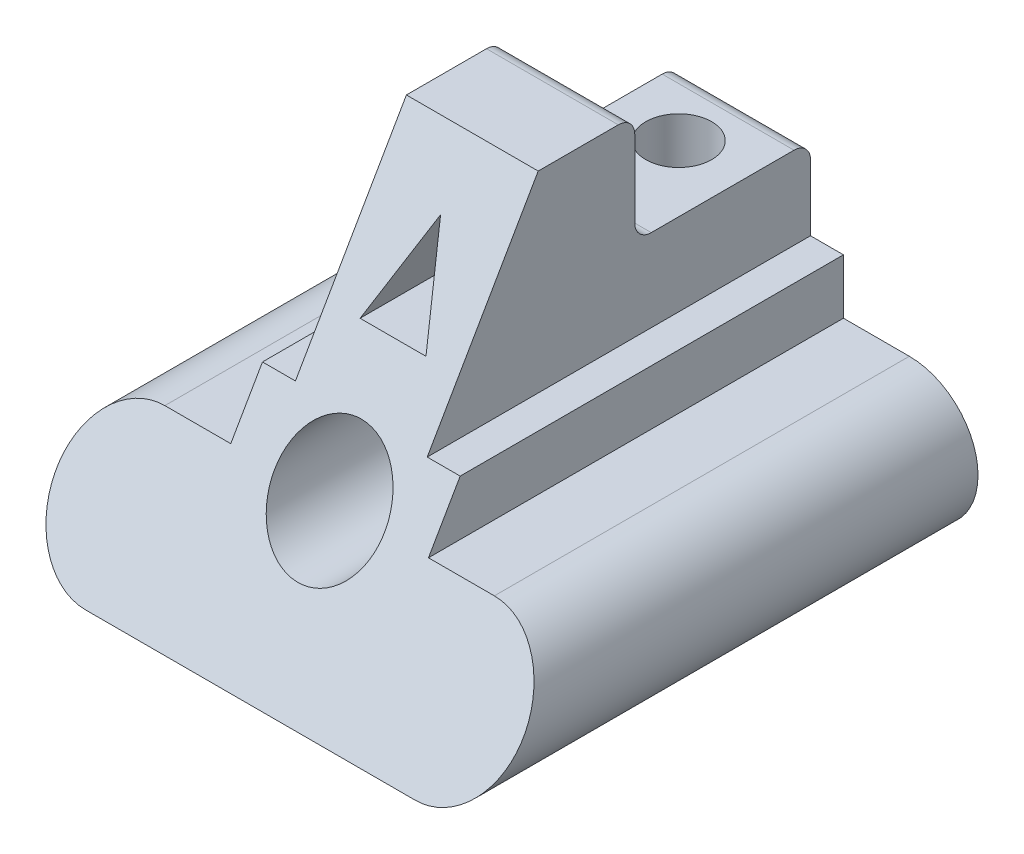
ISO-10303-21;
HEADER;
FILE_DESCRIPTION(('STEP AP214'),'2;1');
FILE_NAME('part.step','',(''),(''),'','','');
FILE_SCHEMA(('AUTOMOTIVE_DESIGN { 1 0 10303 214 1 1 1 1 }'));
ENDSEC;
DATA;
#1=APPLICATION_CONTEXT('core data for automotive mechanical design processes');
#2=APPLICATION_PROTOCOL_DEFINITION('international standard','automotive_design',2000,#1);
#3=PRODUCT_CONTEXT('',#1,'mechanical');
#4=PRODUCT('Part','Part','',(#3));
#5=PRODUCT_RELATED_PRODUCT_CATEGORY('part','',(#4));
#6=PRODUCT_DEFINITION_FORMATION('','',#4);
#7=PRODUCT_DEFINITION_CONTEXT('part definition',#1,'design');
#8=PRODUCT_DEFINITION('design','',#6,#7);
#9=PRODUCT_DEFINITION_SHAPE('','',#8);
#10=(LENGTH_UNIT() NAMED_UNIT(*) SI_UNIT(.MILLI.,.METRE.));
#11=(NAMED_UNIT(*) PLANE_ANGLE_UNIT() SI_UNIT($,.RADIAN.));
#12=(NAMED_UNIT(*) SI_UNIT($,.STERADIAN.) SOLID_ANGLE_UNIT());
#13=UNCERTAINTY_MEASURE_WITH_UNIT(LENGTH_MEASURE(1.E-05),#10,'distance_accuracy_value','');
#14=(GEOMETRIC_REPRESENTATION_CONTEXT(3) GLOBAL_UNCERTAINTY_ASSIGNED_CONTEXT((#13)) GLOBAL_UNIT_ASSIGNED_CONTEXT((#10,
#11,#12)) REPRESENTATION_CONTEXT('',''));
#15=CARTESIAN_POINT('',(0.,0.,0.));
#16=DIRECTION('',(0.,0.,1.));
#17=DIRECTION('',(1.,0.,0.));
#18=AXIS2_PLACEMENT_3D('',#15,#16,#17);
#19=CARTESIAN_POINT('',(-42.5,57.5,4.58548115672677));
#20=DIRECTION('',(0.,-0.499999999999995,-0.866025403784442));
#21=DIRECTION('',(0.,0.866025403784442,-0.499999999999995));
#22=AXIS2_PLACEMENT_3D('',#19,#20,#21);
#23=PLANE('',#22);
#24=CARTESIAN_POINT('',(30.,0.,37.7831216351298));
#25=DIRECTION('',(0.,-0.499999999999995,-0.866025403784442));
#26=DIRECTION('',(0.,0.866025403784442,-0.499999999999995));
#27=AXIS2_PLACEMENT_3D('',#24,#25,#26);
#28=ELLIPSE('',#27,14.4337567297406,12.5);
#29=CARTESIAN_POINT('',(30.,12.5,30.5662432702596));
#30=VERTEX_POINT('',#29);
#31=CARTESIAN_POINT('',(30.,-12.5,45.));
#32=VERTEX_POINT('',#31);
#33=EDGE_CURVE('E255',#30,#32,#28,.T.);
#34=ORIENTED_EDGE('',*,*,#33,.F.);
#35=DIRECTION('',(1.,0.,0.));
#36=VECTOR('',#35,1.);
#37=CARTESIAN_POINT('',(30.,12.5,30.5662432702596));
#38=LINE('',#37,#36);
#39=CARTESIAN_POINT('',(18.,12.5,30.5662432702596));
#40=VERTEX_POINT('',#39);
#41=EDGE_CURVE('E251',#40,#30,#38,.T.);
#42=ORIENTED_EDGE('',*,*,#41,.F.);
#43=DIRECTION('',(0.,-0.866025403784442,0.499999999999995));
#44=VECTOR('',#43,1.);
#45=CARTESIAN_POINT('',(18.,6.25000000000014,34.1746824526946));
#46=LINE('',#45,#44);
#47=CARTESIAN_POINT('',(18.,22.5,24.7927405783634));
#48=VERTEX_POINT('',#47);
#49=EDGE_CURVE('E247',#48,#40,#46,.T.);
#50=ORIENTED_EDGE('',*,*,#49,.F.);
#51=DIRECTION('',(1.,0.,0.));
#52=VECTOR('',#51,1.);
#53=CARTESIAN_POINT('',(18.,22.5,24.7927405783634));
#54=LINE('',#53,#52);
#55=CARTESIAN_POINT('',(12.,22.5,24.7927405783634));
#56=VERTEX_POINT('',#55);
#57=EDGE_CURVE('E243',#56,#48,#54,.T.);
#58=ORIENTED_EDGE('',*,*,#57,.F.);
#59=DIRECTION('',(0.,-0.866025403784442,0.499999999999995));
#60=VECTOR('',#59,1.);
#61=CARTESIAN_POINT('',(12.,13.7500000000002,29.8445554337724));
#62=LINE('',#61,#60);
#63=CARTESIAN_POINT('',(12.,57.5,4.58548115672677));
#64=VERTEX_POINT('',#63);
#65=EDGE_CURVE('E239',#64,#56,#62,.T.);
#66=ORIENTED_EDGE('',*,*,#65,.F.);
#67=DIRECTION('',(1.,0.,0.));
#68=VECTOR('',#67,1.);
#69=CARTESIAN_POINT('',(-42.5,57.5,4.58548115672677));
#70=LINE('',#69,#68);
#71=CARTESIAN_POINT('',(-12.,57.5,4.58548115672677));
#72=VERTEX_POINT('',#71);
#73=EDGE_CURVE('E216',#72,#64,#70,.T.);
#74=ORIENTED_EDGE('',*,*,#73,.F.);
#75=DIRECTION('',(0.,0.866025403784442,-0.499999999999995));
#76=VECTOR('',#75,1.);
#77=CARTESIAN_POINT('',(-12.,13.7500000000002,29.8445554337724));
#78=LINE('',#77,#76);
#79=CARTESIAN_POINT('',(-12.,22.5,24.7927405783634));
#80=VERTEX_POINT('',#79);
#81=EDGE_CURVE('E232',#80,#72,#78,.T.);
#82=ORIENTED_EDGE('',*,*,#81,.F.);
#83=DIRECTION('',(1.,0.,0.));
#84=VECTOR('',#83,1.);
#85=CARTESIAN_POINT('',(-18.,22.5,24.7927405783634));
#86=LINE('',#85,#84);
#87=CARTESIAN_POINT('',(-18.,22.5,24.7927405783634));
#88=VERTEX_POINT('',#87);
#89=EDGE_CURVE('E228',#88,#80,#86,.T.);
#90=ORIENTED_EDGE('',*,*,#89,.F.);
#91=DIRECTION('',(0.,0.866025403784442,-0.499999999999995));
#92=VECTOR('',#91,1.);
#93=CARTESIAN_POINT('',(-18.,6.25000000000014,34.1746824526946));
#94=LINE('',#93,#92);
#95=CARTESIAN_POINT('',(-18.,12.5,30.5662432702596));
#96=VERTEX_POINT('',#95);
#97=EDGE_CURVE('E224',#96,#88,#94,.T.);
#98=ORIENTED_EDGE('',*,*,#97,.F.);
#99=DIRECTION('',(1.,0.,0.));
#100=VECTOR('',#99,1.);
#101=CARTESIAN_POINT('',(-30.,12.5,30.5662432702596));
#102=LINE('',#101,#100);
#103=CARTESIAN_POINT('',(-30.,12.5,30.5662432702596));
#104=VERTEX_POINT('',#103);
#105=EDGE_CURVE('E220',#104,#96,#102,.T.);
#106=ORIENTED_EDGE('',*,*,#105,.F.);
#107=CARTESIAN_POINT('',(-30.,0.,37.7831216351298));
#108=DIRECTION('',(0.,-0.499999999999995,-0.866025403784442));
#109=DIRECTION('',(0.,0.866025403784442,-0.499999999999995));
#110=AXIS2_PLACEMENT_3D('',#107,#108,#109);
#111=ELLIPSE('',#110,14.4337567297406,12.5);
#112=CARTESIAN_POINT('',(-30.,-12.5,45.));
#113=VERTEX_POINT('',#112);
#114=EDGE_CURVE('E236',#113,#104,#111,.T.);
#115=ORIENTED_EDGE('',*,*,#114,.F.);
#116=DIRECTION('',(1.,0.,0.));
#117=VECTOR('',#116,1.);
#118=CARTESIAN_POINT('',(-30.,-12.5,45.));
#119=LINE('',#118,#117);
#120=EDGE_CURVE('E259',#113,#32,#119,.T.);
#121=ORIENTED_EDGE('',*,*,#120,.T.);
#122=EDGE_LOOP('',(#34,#42,#50,#58,#66,#74,#82,#90,#98,#106,#115,#121));
#123=FACE_BOUND('',#122,.T.);
#124=DIRECTION('',(-0.32732683535399,0.818317088384974,-0.472455591261529));
#125=VECTOR('',#124,1.);
#126=CARTESIAN_POINT('',(-8.12500000000003,67.8125000000001,-1.3684434942912));
#127=LINE('',#126,#125);
#128=CARTESIAN_POINT('',(6.,32.5,19.0192378864672));
#129=VERTEX_POINT('',#128);
#130=CARTESIAN_POINT('',(0.,47.5,10.3589838486229));
#131=VERTEX_POINT('',#130);
#132=EDGE_CURVE('E351',#129,#131,#127,.T.);
#133=ORIENTED_EDGE('',*,*,#132,.F.);
#134=DIRECTION('',(1.,0.,0.));
#135=VECTOR('',#134,1.);
#136=CARTESIAN_POINT('',(-42.5,32.5,19.0192378864672));
#137=LINE('',#136,#135);
#138=CARTESIAN_POINT('',(-6.,32.5,19.0192378864672));
#139=VERTEX_POINT('',#138);
#140=EDGE_CURVE('E186',#139,#129,#137,.T.);
#141=ORIENTED_EDGE('',*,*,#140,.F.);
#142=DIRECTION('',(-0.32732683535399,-0.818317088384974,0.472455591261529));
#143=VECTOR('',#142,1.);
#144=CARTESIAN_POINT('',(-0.982142857142883,45.0446428571428,11.7765849560082));
#145=LINE('',#144,#143);
#146=EDGE_CURVE('E347',#131,#139,#145,.T.);
#147=ORIENTED_EDGE('',*,*,#146,.F.);
#148=EDGE_LOOP('',(#133,#141,#147));
#149=FACE_BOUND('',#148,.T.);
#150=CARTESIAN_POINT('',(0.,12.5,30.5662432702596));
#151=DIRECTION('',(0.,-0.499999999999995,-0.866025403784442));
#152=DIRECTION('',(0.,0.866025403784442,-0.499999999999995));
#153=AXIS2_PLACEMENT_3D('',#150,#151,#152);
#154=ELLIPSE('',#153,11.5470053837925,10.);
#155=CARTESIAN_POINT('',(0.,22.5,24.7927405783634));
#156=VERTEX_POINT('',#155);
#157=EDGE_CURVE('E212',#156,#156,#154,.F.);
#158=ORIENTED_EDGE('',*,*,#157,.F.);
#159=EDGE_LOOP('',(#158));
#160=FACE_BOUND('',#159,.T.);
#161=ADVANCED_FACE('F41',(#123,#149,#160),#23,.F.);
#162=CARTESIAN_POINT('',(-30.,0.,45.));
#163=DIRECTION('',(0.,0.,-1.));
#164=DIRECTION('',(-1.,0.,0.));
#165=AXIS2_PLACEMENT_3D('',#162,#163,#164);
#166=CYLINDRICAL_SURFACE('',#165,12.5);
#167=DIRECTION('',(0.,0.,-1.));
#168=VECTOR('',#167,1.);
#169=CARTESIAN_POINT('',(-30.,-12.5,45.));
#170=LINE('',#169,#168);
#171=CARTESIAN_POINT('',(-30.,-12.5,-45.));
#172=VERTEX_POINT('',#171);
#173=EDGE_CURVE('E341',#113,#172,#170,.T.);
#174=ORIENTED_EDGE('',*,*,#173,.F.);
#175=ORIENTED_EDGE('',*,*,#114,.T.);
#176=DIRECTION('',(0.,0.,-1.));
#177=VECTOR('',#176,1.);
#178=CARTESIAN_POINT('',(-30.,12.5,45.));
#179=LINE('',#178,#177);
#180=CARTESIAN_POINT('',(-30.,12.5,-45.));
#181=VERTEX_POINT('',#180);
#182=EDGE_CURVE('E263',#104,#181,#179,.T.);
#183=ORIENTED_EDGE('',*,*,#182,.T.);
#184=CARTESIAN_POINT('',(-30.,0.,-45.));
#185=DIRECTION('',(0.,0.,1.));
#186=DIRECTION('',(1.,0.,0.));
#187=AXIS2_PLACEMENT_3D('',#184,#185,#186);
#188=CIRCLE('',#187,12.5);
#189=EDGE_CURVE('E258',#181,#172,#188,.T.);
#190=ORIENTED_EDGE('',*,*,#189,.T.);
#191=EDGE_LOOP('',(#174,#175,#183,#190));
#192=FACE_BOUND('',#191,.T.);
#193=ADVANCED_FACE('F436',(#192),#166,.T.);
#194=CARTESIAN_POINT('',(-30.,-12.5,45.));
#195=DIRECTION('',(0.,1.,0.));
#196=DIRECTION('',(0.,0.,1.));
#197=AXIS2_PLACEMENT_3D('',#194,#195,#196);
#198=PLANE('',#197);
#199=CARTESIAN_POINT('',(0.,-12.5,-33.));
#200=DIRECTION('',(0.,1.,0.));
#201=DIRECTION('',(0.,0.,1.));
#202=AXIS2_PLACEMENT_3D('',#199,#200,#201);
#203=CIRCLE('',#202,6.);
#204=CARTESIAN_POINT('',(0.,-12.5,-27.));
#205=VERTEX_POINT('',#204);
#206=EDGE_CURVE('E367',#205,#205,#203,.T.);
#207=ORIENTED_EDGE('',*,*,#206,.T.);
#208=EDGE_LOOP('',(#207));
#209=FACE_BOUND('',#208,.T.);
#210=DIRECTION('',(1.,0.,0.));
#211=VECTOR('',#210,1.);
#212=CARTESIAN_POINT('',(-30.,-12.5,-45.));
#213=LINE('',#212,#211);
#214=CARTESIAN_POINT('',(30.,-12.5,-45.));
#215=VERTEX_POINT('',#214);
#216=EDGE_CURVE('E268',#172,#215,#213,.T.);
#217=ORIENTED_EDGE('',*,*,#216,.T.);
#218=DIRECTION('',(0.,0.,-1.));
#219=VECTOR('',#218,1.);
#220=CARTESIAN_POINT('',(30.,-12.5,45.));
#221=LINE('',#220,#219);
#222=EDGE_CURVE('E337',#32,#215,#221,.T.);
#223=ORIENTED_EDGE('',*,*,#222,.F.);
#224=ORIENTED_EDGE('',*,*,#120,.F.);
#225=ORIENTED_EDGE('',*,*,#173,.T.);
#226=EDGE_LOOP('',(#217,#223,#224,#225));
#227=FACE_BOUND('',#226,.T.);
#228=ADVANCED_FACE('F501',(#209,#227),#198,.F.);
#229=CARTESIAN_POINT('',(30.,0.,45.));
#230=DIRECTION('',(0.,0.,-1.));
#231=DIRECTION('',(-1.,0.,0.));
#232=AXIS2_PLACEMENT_3D('',#229,#230,#231);
#233=CYLINDRICAL_SURFACE('',#232,12.5);
#234=ORIENTED_EDGE('',*,*,#33,.T.);
#235=ORIENTED_EDGE('',*,*,#222,.T.);
#236=CARTESIAN_POINT('',(30.,0.,-45.));
#237=DIRECTION('',(0.,0.,1.));
#238=DIRECTION('',(-1.,0.,0.));
#239=AXIS2_PLACEMENT_3D('',#236,#237,#238);
#240=CIRCLE('',#239,12.5);
#241=CARTESIAN_POINT('',(30.,12.5,-45.));
#242=VERTEX_POINT('',#241);
#243=EDGE_CURVE('E271',#215,#242,#240,.T.);
#244=ORIENTED_EDGE('',*,*,#243,.T.);
#245=DIRECTION('',(0.,0.,-1.));
#246=VECTOR('',#245,1.);
#247=CARTESIAN_POINT('',(30.,12.5,45.));
#248=LINE('',#247,#246);
#249=EDGE_CURVE('E334',#30,#242,#248,.T.);
#250=ORIENTED_EDGE('',*,*,#249,.F.);
#251=EDGE_LOOP('',(#234,#235,#244,#250));
#252=FACE_BOUND('',#251,.T.);
#253=ADVANCED_FACE('F497',(#252),#233,.T.);
#254=CARTESIAN_POINT('',(30.,12.5,45.));
#255=DIRECTION('',(0.,-1.,0.));
#256=DIRECTION('',(0.,0.,-1.));
#257=AXIS2_PLACEMENT_3D('',#254,#255,#256);
#258=PLANE('',#257);
#259=DIRECTION('',(0.,0.,-1.));
#260=VECTOR('',#259,1.);
#261=CARTESIAN_POINT('',(18.,12.5,45.));
#262=LINE('',#261,#260);
#263=CARTESIAN_POINT('',(18.,12.5,-45.));
#264=VERTEX_POINT('',#263);
#265=EDGE_CURVE('E331',#40,#264,#262,.T.);
#266=ORIENTED_EDGE('',*,*,#265,.F.);
#267=ORIENTED_EDGE('',*,*,#41,.T.);
#268=ORIENTED_EDGE('',*,*,#249,.T.);
#269=DIRECTION('',(-1.,0.,0.));
#270=VECTOR('',#269,1.);
#271=CARTESIAN_POINT('',(30.,12.5,-45.));
#272=LINE('',#271,#270);
#273=EDGE_CURVE('E275',#242,#264,#272,.T.);
#274=ORIENTED_EDGE('',*,*,#273,.T.);
#275=EDGE_LOOP('',(#266,#267,#268,#274));
#276=FACE_BOUND('',#275,.T.);
#277=ADVANCED_FACE('F493',(#276),#258,.F.);
#278=CARTESIAN_POINT('',(18.,12.5,45.));
#279=DIRECTION('',(-1.,0.,0.));
#280=DIRECTION('',(0.,0.,1.));
#281=AXIS2_PLACEMENT_3D('',#278,#279,#280);
#282=PLANE('',#281);
#283=DIRECTION('',(0.,0.,-1.));
#284=VECTOR('',#283,1.);
#285=CARTESIAN_POINT('',(18.,22.5,45.));
#286=LINE('',#285,#284);
#287=CARTESIAN_POINT('',(18.,22.5,-45.));
#288=VERTEX_POINT('',#287);
#289=EDGE_CURVE('E328',#48,#288,#286,.T.);
#290=ORIENTED_EDGE('',*,*,#289,.F.);
#291=ORIENTED_EDGE('',*,*,#49,.T.);
#292=ORIENTED_EDGE('',*,*,#265,.T.);
#293=DIRECTION('',(0.,1.,0.));
#294=VECTOR('',#293,1.);
#295=CARTESIAN_POINT('',(18.,12.5,-45.));
#296=LINE('',#295,#294);
#297=EDGE_CURVE('E279',#264,#288,#296,.T.);
#298=ORIENTED_EDGE('',*,*,#297,.T.);
#299=EDGE_LOOP('',(#290,#291,#292,#298));
#300=FACE_BOUND('',#299,.T.);
#301=ADVANCED_FACE('F489',(#300),#282,.F.);
#302=CARTESIAN_POINT('',(18.,22.5,45.));
#303=DIRECTION('',(0.,-1.,0.));
#304=DIRECTION('',(0.,0.,-1.));
#305=AXIS2_PLACEMENT_3D('',#302,#303,#304);
#306=PLANE('',#305);
#307=DIRECTION('',(0.,0.,-1.));
#308=VECTOR('',#307,1.);
#309=CARTESIAN_POINT('',(12.,22.5,45.));
#310=LINE('',#309,#308);
#311=CARTESIAN_POINT('',(12.,22.5,-45.));
#312=VERTEX_POINT('',#311);
#313=EDGE_CURVE('E325',#56,#312,#310,.T.);
#314=ORIENTED_EDGE('',*,*,#313,.F.);
#315=ORIENTED_EDGE('',*,*,#57,.T.);
#316=ORIENTED_EDGE('',*,*,#289,.T.);
#317=DIRECTION('',(-1.,0.,0.));
#318=VECTOR('',#317,1.);
#319=CARTESIAN_POINT('',(18.,22.5,-45.));
#320=LINE('',#319,#318);
#321=EDGE_CURVE('E283',#288,#312,#320,.T.);
#322=ORIENTED_EDGE('',*,*,#321,.T.);
#323=EDGE_LOOP('',(#314,#315,#316,#322));
#324=FACE_BOUND('',#323,.T.);
#325=ADVANCED_FACE('F486',(#324),#306,.F.);
#326=CARTESIAN_POINT('',(12.,22.5,45.));
#327=DIRECTION('',(-1.,0.,0.));
#328=DIRECTION('',(0.,0.,1.));
#329=AXIS2_PLACEMENT_3D('',#326,#327,#328);
#330=PLANE('',#329);
#331=DIRECTION('',(0.,1.,0.));
#332=VECTOR('',#331,1.);
#333=CARTESIAN_POINT('',(12.,22.5,-13.));
#334=LINE('',#333,#332);
#335=CARTESIAN_POINT('',(12.,40.5,-13.));
#336=VERTEX_POINT('',#335);
#337=CARTESIAN_POINT('',(12.,54.5,-13.));
#338=VERTEX_POINT('',#337);
#339=EDGE_CURVE('E415',#336,#338,#334,.T.);
#340=ORIENTED_EDGE('',*,*,#339,.T.);
#341=CARTESIAN_POINT('',(12.,54.5,-9.99999999999999));
#342=DIRECTION('',(-1.,0.,0.));
#343=DIRECTION('',(0.,0.,1.));
#344=AXIS2_PLACEMENT_3D('',#341,#342,#343);
#345=CIRCLE('',#344,3.);
#346=CARTESIAN_POINT('',(12.,57.5,-9.99999999999998));
#347=VERTEX_POINT('',#346);
#348=EDGE_CURVE('E386',#338,#347,#345,.F.);
#349=ORIENTED_EDGE('',*,*,#348,.T.);
#350=DIRECTION('',(0.,0.,-1.));
#351=VECTOR('',#350,1.);
#352=CARTESIAN_POINT('',(12.,57.5,45.));
#353=LINE('',#352,#351);
#354=EDGE_CURVE('E321',#64,#347,#353,.T.);
#355=ORIENTED_EDGE('',*,*,#354,.F.);
#356=ORIENTED_EDGE('',*,*,#65,.T.);
#357=ORIENTED_EDGE('',*,*,#313,.T.);
#358=DIRECTION('',(0.,1.,0.));
#359=VECTOR('',#358,1.);
#360=CARTESIAN_POINT('',(12.,22.5,-45.));
#361=LINE('',#360,#359);
#362=CARTESIAN_POINT('',(12.,34.5,-45.));
#363=VERTEX_POINT('',#362);
#364=EDGE_CURVE('E287',#312,#363,#361,.T.);
#365=ORIENTED_EDGE('',*,*,#364,.T.);
#366=CARTESIAN_POINT('',(12.,34.5,-42.));
#367=DIRECTION('',(-1.,0.,0.));
#368=DIRECTION('',(0.,0.,1.));
#369=AXIS2_PLACEMENT_3D('',#366,#367,#368);
#370=CIRCLE('',#369,3.);
#371=CARTESIAN_POINT('',(12.,37.5,-42.));
#372=VERTEX_POINT('',#371);
#373=EDGE_CURVE('E57',#363,#372,#370,.F.);
#374=ORIENTED_EDGE('',*,*,#373,.T.);
#375=DIRECTION('',(0.,0.,1.));
#376=VECTOR('',#375,1.);
#377=CARTESIAN_POINT('',(12.,37.5,45.));
#378=LINE('',#377,#376);
#379=CARTESIAN_POINT('',(12.,37.5,-16.));
#380=VERTEX_POINT('',#379);
#381=EDGE_CURVE('E407',#372,#380,#378,.T.);
#382=ORIENTED_EDGE('',*,*,#381,.T.);
#383=CARTESIAN_POINT('',(12.,40.5,-16.));
#384=DIRECTION('',(-1.,0.,0.));
#385=DIRECTION('',(0.,0.,1.));
#386=AXIS2_PLACEMENT_3D('',#383,#384,#385);
#387=CIRCLE('',#386,3.);
#388=EDGE_CURVE('E11',#380,#336,#387,.T.);
#389=ORIENTED_EDGE('',*,*,#388,.T.);
#390=EDGE_LOOP('',(#340,#349,#355,#356,#357,#365,#374,#382,#389));
#391=FACE_BOUND('',#390,.T.);
#392=ADVANCED_FACE('F414',(#391),#330,.F.);
#393=CARTESIAN_POINT('',(-12.,57.5,45.));
#394=DIRECTION('',(0.,-1.,0.));
#395=DIRECTION('',(0.,0.,-1.));
#396=AXIS2_PLACEMENT_3D('',#393,#394,#395);
#397=PLANE('',#396);
#398=ORIENTED_EDGE('',*,*,#354,.T.);
#399=DIRECTION('',(-1.,0.,0.));
#400=VECTOR('',#399,1.);
#401=CARTESIAN_POINT('',(-12.,57.5,-9.99999999999999));
#402=LINE('',#401,#400);
#403=CARTESIAN_POINT('',(-12.,57.5,-9.99999999999998));
#404=VERTEX_POINT('',#403);
#405=EDGE_CURVE('E361',#347,#404,#402,.T.);
#406=ORIENTED_EDGE('',*,*,#405,.T.);
#407=DIRECTION('',(0.,0.,-1.));
#408=VECTOR('',#407,1.);
#409=CARTESIAN_POINT('',(-12.,57.5,45.));
#410=LINE('',#409,#408);
#411=EDGE_CURVE('E317',#72,#404,#410,.T.);
#412=ORIENTED_EDGE('',*,*,#411,.F.);
#413=ORIENTED_EDGE('',*,*,#73,.T.);
#414=EDGE_LOOP('',(#398,#406,#412,#413));
#415=FACE_BOUND('',#414,.T.);
#416=ADVANCED_FACE('F480',(#415),#397,.F.);
#417=CARTESIAN_POINT('',(-12.,22.5,45.));
#418=DIRECTION('',(1.,0.,0.));
#419=DIRECTION('',(0.,0.,-1.));
#420=AXIS2_PLACEMENT_3D('',#417,#418,#419);
#421=PLANE('',#420);
#422=ORIENTED_EDGE('',*,*,#411,.T.);
#423=CARTESIAN_POINT('',(-12.,54.5,-9.99999999999999));
#424=DIRECTION('',(1.,0.,0.));
#425=DIRECTION('',(0.,0.,-1.));
#426=AXIS2_PLACEMENT_3D('',#423,#424,#425);
#427=CIRCLE('',#426,3.);
#428=CARTESIAN_POINT('',(-12.,54.5,-13.));
#429=VERTEX_POINT('',#428);
#430=EDGE_CURVE('E374',#404,#429,#427,.F.);
#431=ORIENTED_EDGE('',*,*,#430,.T.);
#432=DIRECTION('',(0.,-1.,0.));
#433=VECTOR('',#432,1.);
#434=CARTESIAN_POINT('',(-12.,22.5,-13.));
#435=LINE('',#434,#433);
#436=CARTESIAN_POINT('',(-12.,40.5,-13.));
#437=VERTEX_POINT('',#436);
#438=EDGE_CURVE('E354',#429,#437,#435,.T.);
#439=ORIENTED_EDGE('',*,*,#438,.T.);
#440=CARTESIAN_POINT('',(-12.,40.5,-16.));
#441=DIRECTION('',(1.,0.,0.));
#442=DIRECTION('',(0.,0.,-1.));
#443=AXIS2_PLACEMENT_3D('',#440,#441,#442);
#444=CIRCLE('',#443,3.);
#445=CARTESIAN_POINT('',(-12.,37.5,-16.));
#446=VERTEX_POINT('',#445);
#447=EDGE_CURVE('E50',#437,#446,#444,.T.);
#448=ORIENTED_EDGE('',*,*,#447,.T.);
#449=DIRECTION('',(0.,0.,-1.));
#450=VECTOR('',#449,1.);
#451=CARTESIAN_POINT('',(-12.,37.5,45.));
#452=LINE('',#451,#450);
#453=CARTESIAN_POINT('',(-12.,37.5,-42.));
#454=VERTEX_POINT('',#453);
#455=EDGE_CURVE('E366',#446,#454,#452,.T.);
#456=ORIENTED_EDGE('',*,*,#455,.T.);
#457=CARTESIAN_POINT('',(-12.,34.5,-42.));
#458=DIRECTION('',(1.,0.,0.));
#459=DIRECTION('',(0.,0.,-1.));
#460=AXIS2_PLACEMENT_3D('',#457,#458,#459);
#461=CIRCLE('',#460,3.);
#462=CARTESIAN_POINT('',(-12.,34.5,-45.));
#463=VERTEX_POINT('',#462);
#464=EDGE_CURVE('E371',#454,#463,#461,.F.);
#465=ORIENTED_EDGE('',*,*,#464,.T.);
#466=DIRECTION('',(0.,-1.,0.));
#467=VECTOR('',#466,1.);
#468=CARTESIAN_POINT('',(-12.,22.5,-45.));
#469=LINE('',#468,#467);
#470=CARTESIAN_POINT('',(-12.,22.5,-45.));
#471=VERTEX_POINT('',#470);
#472=EDGE_CURVE('E291',#463,#471,#469,.T.);
#473=ORIENTED_EDGE('',*,*,#472,.T.);
#474=DIRECTION('',(0.,0.,-1.));
#475=VECTOR('',#474,1.);
#476=CARTESIAN_POINT('',(-12.,22.5,45.));
#477=LINE('',#476,#475);
#478=EDGE_CURVE('E313',#80,#471,#477,.T.);
#479=ORIENTED_EDGE('',*,*,#478,.F.);
#480=ORIENTED_EDGE('',*,*,#81,.T.);
#481=EDGE_LOOP('',(#422,#431,#439,#448,#456,#465,#473,#479,#480));
#482=FACE_BOUND('',#481,.T.);
#483=ADVANCED_FACE('F400',(#482),#421,.F.);
#484=CARTESIAN_POINT('',(-18.,22.5,45.));
#485=DIRECTION('',(0.,-1.,0.));
#486=DIRECTION('',(0.,0.,-1.));
#487=AXIS2_PLACEMENT_3D('',#484,#485,#486);
#488=PLANE('',#487);
#489=DIRECTION('',(0.,0.,-1.));
#490=VECTOR('',#489,1.);
#491=CARTESIAN_POINT('',(-18.,22.5,45.));
#492=LINE('',#491,#490);
#493=CARTESIAN_POINT('',(-18.,22.5,-45.));
#494=VERTEX_POINT('',#493);
#495=EDGE_CURVE('E310',#88,#494,#492,.T.);
#496=ORIENTED_EDGE('',*,*,#495,.F.);
#497=ORIENTED_EDGE('',*,*,#89,.T.);
#498=ORIENTED_EDGE('',*,*,#478,.T.);
#499=DIRECTION('',(-1.,0.,0.));
#500=VECTOR('',#499,1.);
#501=CARTESIAN_POINT('',(-18.,22.5,-45.));
#502=LINE('',#501,#500);
#503=EDGE_CURVE('E294',#471,#494,#502,.T.);
#504=ORIENTED_EDGE('',*,*,#503,.T.);
#505=EDGE_LOOP('',(#496,#497,#498,#504));
#506=FACE_BOUND('',#505,.T.);
#507=ADVANCED_FACE('F473',(#506),#488,.F.);
#508=CARTESIAN_POINT('',(-18.,12.5,45.));
#509=DIRECTION('',(1.,0.,0.));
#510=DIRECTION('',(0.,0.,-1.));
#511=AXIS2_PLACEMENT_3D('',#508,#509,#510);
#512=PLANE('',#511);
#513=DIRECTION('',(0.,0.,-1.));
#514=VECTOR('',#513,1.);
#515=CARTESIAN_POINT('',(-18.,12.5,45.));
#516=LINE('',#515,#514);
#517=CARTESIAN_POINT('',(-18.,12.5,-45.));
#518=VERTEX_POINT('',#517);
#519=EDGE_CURVE('E307',#96,#518,#516,.T.);
#520=ORIENTED_EDGE('',*,*,#519,.F.);
#521=ORIENTED_EDGE('',*,*,#97,.T.);
#522=ORIENTED_EDGE('',*,*,#495,.T.);
#523=DIRECTION('',(0.,-1.,0.));
#524=VECTOR('',#523,1.);
#525=CARTESIAN_POINT('',(-18.,12.5,-45.));
#526=LINE('',#525,#524);
#527=EDGE_CURVE('E298',#494,#518,#526,.T.);
#528=ORIENTED_EDGE('',*,*,#527,.T.);
#529=EDGE_LOOP('',(#520,#521,#522,#528));
#530=FACE_BOUND('',#529,.T.);
#531=ADVANCED_FACE('F469',(#530),#512,.F.);
#532=CARTESIAN_POINT('',(-30.,12.5,45.));
#533=DIRECTION('',(0.,-1.,0.));
#534=DIRECTION('',(0.,0.,-1.));
#535=AXIS2_PLACEMENT_3D('',#532,#533,#534);
#536=PLANE('',#535);
#537=ORIENTED_EDGE('',*,*,#182,.F.);
#538=ORIENTED_EDGE('',*,*,#105,.T.);
#539=ORIENTED_EDGE('',*,*,#519,.T.);
#540=DIRECTION('',(-1.,0.,0.));
#541=VECTOR('',#540,1.);
#542=CARTESIAN_POINT('',(-30.,12.5,-45.));
#543=LINE('',#542,#541);
#544=EDGE_CURVE('E264',#518,#181,#543,.T.);
#545=ORIENTED_EDGE('',*,*,#544,.T.);
#546=EDGE_LOOP('',(#537,#538,#539,#545));
#547=FACE_BOUND('',#546,.T.);
#548=ADVANCED_FACE('F465',(#547),#536,.F.);
#549=CARTESIAN_POINT('',(-30.,0.,-45.));
#550=DIRECTION('',(0.,0.,1.));
#551=DIRECTION('',(1.,0.,0.));
#552=AXIS2_PLACEMENT_3D('',#549,#550,#551);
#553=PLANE('',#552);
#554=ORIENTED_EDGE('',*,*,#472,.F.);
#555=DIRECTION('',(1.,0.,0.));
#556=VECTOR('',#555,1.);
#557=CARTESIAN_POINT('',(-30.,34.5,-45.));
#558=LINE('',#557,#556);
#559=EDGE_CURVE('E394',#463,#363,#558,.T.);
#560=ORIENTED_EDGE('',*,*,#559,.T.);
#561=ORIENTED_EDGE('',*,*,#364,.F.);
#562=ORIENTED_EDGE('',*,*,#321,.F.);
#563=ORIENTED_EDGE('',*,*,#297,.F.);
#564=ORIENTED_EDGE('',*,*,#273,.F.);
#565=ORIENTED_EDGE('',*,*,#243,.F.);
#566=ORIENTED_EDGE('',*,*,#216,.F.);
#567=ORIENTED_EDGE('',*,*,#189,.F.);
#568=ORIENTED_EDGE('',*,*,#544,.F.);
#569=ORIENTED_EDGE('',*,*,#527,.F.);
#570=ORIENTED_EDGE('',*,*,#503,.F.);
#571=EDGE_LOOP('',(#554,#560,#561,#562,#563,#564,#565,#566,#567,#568,#569,#570));
#572=FACE_BOUND('',#571,.T.);
#573=ADVANCED_FACE('F458',(#572),#553,.F.);
#574=CARTESIAN_POINT('',(6.,32.5,45.));
#575=DIRECTION('',(-0.928476690885259,-0.371390676354104,0.));
#576=DIRECTION('',(0.371390676354104,-0.928476690885259,0.));
#577=AXIS2_PLACEMENT_3D('',#574,#575,#576);
#578=PLANE('',#577);
#579=ORIENTED_EDGE('',*,*,#132,.T.);
#580=DIRECTION('',(0.,0.,-1.));
#581=VECTOR('',#580,1.);
#582=CARTESIAN_POINT('',(0.,47.5,45.));
#583=LINE('',#582,#581);
#584=CARTESIAN_POINT('',(0.,47.5,0.));
#585=VERTEX_POINT('',#584);
#586=EDGE_CURVE('E204',#131,#585,#583,.T.);
#587=ORIENTED_EDGE('',*,*,#586,.T.);
#588=DIRECTION('',(-0.371390676354104,0.928476690885259,0.));
#589=VECTOR('',#588,1.);
#590=CARTESIAN_POINT('',(6.,32.5,0.));
#591=LINE('',#590,#589);
#592=CARTESIAN_POINT('',(6.,32.5,0.));
#593=VERTEX_POINT('',#592);
#594=EDGE_CURVE('E197',#593,#585,#591,.T.);
#595=ORIENTED_EDGE('',*,*,#594,.F.);
#596=DIRECTION('',(0.,0.,-1.));
#597=VECTOR('',#596,1.);
#598=CARTESIAN_POINT('',(6.,32.5,45.));
#599=LINE('',#598,#597);
#600=EDGE_CURVE('E181',#129,#593,#599,.T.);
#601=ORIENTED_EDGE('',*,*,#600,.F.);
#602=EDGE_LOOP('',(#579,#587,#595,#601));
#603=FACE_BOUND('',#602,.T.);
#604=ADVANCED_FACE('F202',(#603),#578,.T.);
#605=CARTESIAN_POINT('',(0.,47.5,45.));
#606=DIRECTION('',(0.928476690885259,-0.371390676354104,0.));
#607=DIRECTION('',(0.371390676354104,0.928476690885259,0.));
#608=AXIS2_PLACEMENT_3D('',#605,#606,#607);
#609=PLANE('',#608);
#610=ORIENTED_EDGE('',*,*,#146,.T.);
#611=DIRECTION('',(0.,0.,-1.));
#612=VECTOR('',#611,1.);
#613=CARTESIAN_POINT('',(-6.,32.5,45.));
#614=LINE('',#613,#612);
#615=CARTESIAN_POINT('',(-6.,32.5,0.));
#616=VERTEX_POINT('',#615);
#617=EDGE_CURVE('E191',#139,#616,#614,.T.);
#618=ORIENTED_EDGE('',*,*,#617,.T.);
#619=DIRECTION('',(-0.371390676354104,-0.928476690885259,0.));
#620=VECTOR('',#619,1.);
#621=CARTESIAN_POINT('',(0.,47.5,0.));
#622=LINE('',#621,#620);
#623=EDGE_CURVE('E199',#585,#616,#622,.T.);
#624=ORIENTED_EDGE('',*,*,#623,.F.);
#625=ORIENTED_EDGE('',*,*,#586,.F.);
#626=EDGE_LOOP('',(#610,#618,#624,#625));
#627=FACE_BOUND('',#626,.T.);
#628=ADVANCED_FACE('F431',(#627),#609,.T.);
#629=CARTESIAN_POINT('',(-6.,32.5,45.));
#630=DIRECTION('',(0.,1.,0.));
#631=DIRECTION('',(0.,0.,1.));
#632=AXIS2_PLACEMENT_3D('',#629,#630,#631);
#633=PLANE('',#632);
#634=ORIENTED_EDGE('',*,*,#140,.T.);
#635=ORIENTED_EDGE('',*,*,#600,.T.);
#636=DIRECTION('',(1.,0.,0.));
#637=VECTOR('',#636,1.);
#638=CARTESIAN_POINT('',(-6.,32.5,0.));
#639=LINE('',#638,#637);
#640=EDGE_CURVE('E184',#616,#593,#639,.T.);
#641=ORIENTED_EDGE('',*,*,#640,.F.);
#642=ORIENTED_EDGE('',*,*,#617,.F.);
#643=EDGE_LOOP('',(#634,#635,#641,#642));
#644=FACE_BOUND('',#643,.T.);
#645=ADVANCED_FACE('F183',(#644),#633,.T.);
#646=CARTESIAN_POINT('',(0.,0.,0.));
#647=DIRECTION('',(0.,0.,-1.));
#648=DIRECTION('',(-1.,0.,0.));
#649=AXIS2_PLACEMENT_3D('',#646,#647,#648);
#650=PLANE('',#649);
#651=ORIENTED_EDGE('',*,*,#594,.T.);
#652=ORIENTED_EDGE('',*,*,#623,.T.);
#653=ORIENTED_EDGE('',*,*,#640,.T.);
#654=EDGE_LOOP('',(#651,#652,#653));
#655=FACE_BOUND('',#654,.T.);
#656=ADVANCED_FACE('F196',(#655),#650,.F.);
#657=CARTESIAN_POINT('',(0.,12.5,45.));
#658=DIRECTION('',(0.,0.,-1.));
#659=DIRECTION('',(-1.,0.,0.));
#660=AXIS2_PLACEMENT_3D('',#657,#658,#659);
#661=CYLINDRICAL_SURFACE('',#660,10.);
#662=CARTESIAN_POINT('',(0.,12.5,0.));
#663=DIRECTION('',(0.,0.,1.));
#664=DIRECTION('',(1.,0.,0.));
#665=AXIS2_PLACEMENT_3D('',#662,#663,#664);
#666=CIRCLE('',#665,10.);
#667=CARTESIAN_POINT('',(10.,12.5,0.));
#668=VERTEX_POINT('',#667);
#669=EDGE_CURVE('E206',#668,#668,#666,.T.);
#670=ORIENTED_EDGE('',*,*,#669,.F.);
#671=EDGE_LOOP('',(#670));
#672=FACE_BOUND('',#671,.T.);
#673=ORIENTED_EDGE('',*,*,#157,.T.);
#674=EDGE_LOOP('',(#673));
#675=FACE_BOUND('',#674,.T.);
#676=ADVANCED_FACE('F441',(#672,#675),#661,.F.);
#677=CARTESIAN_POINT('',(0.,12.5,0.));
#678=DIRECTION('',(0.,0.,1.));
#679=DIRECTION('',(1.,0.,0.));
#680=AXIS2_PLACEMENT_3D('',#677,#678,#679);
#681=PLANE('',#680);
#682=ORIENTED_EDGE('',*,*,#669,.T.);
#683=EDGE_LOOP('',(#682));
#684=FACE_BOUND('',#683,.T.);
#685=ADVANCED_FACE('F443',(#684),#681,.T.);
#686=CARTESIAN_POINT('',(42.5,57.5,-13.));
#687=DIRECTION('',(0.,0.,1.));
#688=DIRECTION('',(1.,0.,0.));
#689=AXIS2_PLACEMENT_3D('',#686,#687,#688);
#690=PLANE('',#689);
#691=ORIENTED_EDGE('',*,*,#438,.F.);
#692=DIRECTION('',(-1.,0.,0.));
#693=VECTOR('',#692,1.);
#694=CARTESIAN_POINT('',(42.5,54.5,-13.));
#695=LINE('',#694,#693);
#696=EDGE_CURVE('E381',#429,#338,#695,.F.);
#697=ORIENTED_EDGE('',*,*,#696,.T.);
#698=ORIENTED_EDGE('',*,*,#339,.F.);
#699=DIRECTION('',(-1.,0.,0.));
#700=VECTOR('',#699,1.);
#701=CARTESIAN_POINT('',(-12.,40.5,-13.));
#702=LINE('',#701,#700);
#703=EDGE_CURVE('E377',#336,#437,#702,.T.);
#704=ORIENTED_EDGE('',*,*,#703,.T.);
#705=EDGE_LOOP('',(#691,#697,#698,#704));
#706=FACE_BOUND('',#705,.T.);
#707=ADVANCED_FACE('F418',(#706),#690,.F.);
#708=CARTESIAN_POINT('',(42.5,37.5,-45.));
#709=DIRECTION('',(0.,-1.,0.));
#710=DIRECTION('',(0.,0.,-1.));
#711=AXIS2_PLACEMENT_3D('',#708,#709,#710);
#712=PLANE('',#711);
#713=CARTESIAN_POINT('',(0.,37.5,-33.));
#714=DIRECTION('',(0.,-1.,0.));
#715=DIRECTION('',(0.,0.,-1.));
#716=AXIS2_PLACEMENT_3D('',#713,#714,#715);
#717=CIRCLE('',#716,6.);
#718=CARTESIAN_POINT('',(0.,37.5,-39.));
#719=VERTEX_POINT('',#718);
#720=EDGE_CURVE('E362',#719,#719,#717,.T.);
#721=ORIENTED_EDGE('',*,*,#720,.T.);
#722=EDGE_LOOP('',(#721));
#723=FACE_BOUND('',#722,.T.);
#724=ORIENTED_EDGE('',*,*,#455,.F.);
#725=DIRECTION('',(-1.,0.,0.));
#726=VECTOR('',#725,1.);
#727=CARTESIAN_POINT('',(12.,37.5,-16.));
#728=LINE('',#727,#726);
#729=EDGE_CURVE('E65',#446,#380,#728,.F.);
#730=ORIENTED_EDGE('',*,*,#729,.T.);
#731=ORIENTED_EDGE('',*,*,#381,.F.);
#732=DIRECTION('',(1.,0.,0.));
#733=VECTOR('',#732,1.);
#734=CARTESIAN_POINT('',(42.5,37.5,-42.));
#735=LINE('',#734,#733);
#736=EDGE_CURVE('E389',#372,#454,#735,.F.);
#737=ORIENTED_EDGE('',*,*,#736,.T.);
#738=EDGE_LOOP('',(#724,#730,#731,#737));
#739=FACE_BOUND('',#738,.T.);
#740=ADVANCED_FACE('F405',(#723,#739),#712,.F.);
#741=CARTESIAN_POINT('',(0.,-12.5,-33.));
#742=DIRECTION('',(0.,1.,0.));
#743=DIRECTION('',(0.,0.,1.));
#744=AXIS2_PLACEMENT_3D('',#741,#742,#743);
#745=CYLINDRICAL_SURFACE('',#744,6.);
#746=ORIENTED_EDGE('',*,*,#206,.F.);
#747=EDGE_LOOP('',(#746));
#748=FACE_BOUND('',#747,.T.);
#749=ORIENTED_EDGE('',*,*,#720,.F.);
#750=EDGE_LOOP('',(#749));
#751=FACE_BOUND('',#750,.T.);
#752=ADVANCED_FACE('F511',(#748,#751),#745,.F.);
#753=CARTESIAN_POINT('',(-12.,54.5,-9.99999999999999));
#754=DIRECTION('',(-1.,0.,0.));
#755=DIRECTION('',(0.,0.,1.));
#756=AXIS2_PLACEMENT_3D('',#753,#754,#755);
#757=CYLINDRICAL_SURFACE('',#756,3.);
#758=ORIENTED_EDGE('',*,*,#348,.F.);
#759=ORIENTED_EDGE('',*,*,#696,.F.);
#760=ORIENTED_EDGE('',*,*,#430,.F.);
#761=ORIENTED_EDGE('',*,*,#405,.F.);
#762=EDGE_LOOP('',(#758,#759,#760,#761));
#763=FACE_BOUND('',#762,.T.);
#764=ADVANCED_FACE('F509',(#763),#757,.T.);
#765=CARTESIAN_POINT('',(42.5,40.5,-16.));
#766=DIRECTION('',(1.,0.,0.));
#767=DIRECTION('',(0.,0.,-1.));
#768=AXIS2_PLACEMENT_3D('',#765,#766,#767);
#769=CYLINDRICAL_SURFACE('',#768,3.);
#770=ORIENTED_EDGE('',*,*,#388,.F.);
#771=ORIENTED_EDGE('',*,*,#729,.F.);
#772=ORIENTED_EDGE('',*,*,#447,.F.);
#773=ORIENTED_EDGE('',*,*,#703,.F.);
#774=EDGE_LOOP('',(#770,#771,#772,#773));
#775=FACE_BOUND('',#774,.T.);
#776=ADVANCED_FACE('F410',(#775),#769,.F.);
#777=CARTESIAN_POINT('',(-30.,34.5,-42.));
#778=DIRECTION('',(1.,0.,0.));
#779=DIRECTION('',(0.,0.,-1.));
#780=AXIS2_PLACEMENT_3D('',#777,#778,#779);
#781=CYLINDRICAL_SURFACE('',#780,3.);
#782=ORIENTED_EDGE('',*,*,#464,.F.);
#783=ORIENTED_EDGE('',*,*,#736,.F.);
#784=ORIENTED_EDGE('',*,*,#373,.F.);
#785=ORIENTED_EDGE('',*,*,#559,.F.);
#786=EDGE_LOOP('',(#782,#783,#784,#785));
#787=FACE_BOUND('',#786,.T.);
#788=ADVANCED_FACE('F43',(#787),#781,.T.);
#789=CLOSED_SHELL('',(#161,#193,#228,#253,#277,#301,#325,#392,#416,#483,#507,#531,#548,#573,
#604,#628,#645,#656,#676,#685,#707,#740,#752,#764,#776,#788));
#790=MANIFOLD_SOLID_BREP('B2',#789);
#791=ADVANCED_BREP_SHAPE_REPRESENTATION('',(#18,#790),#14);
#792=SHAPE_DEFINITION_REPRESENTATION(#9,#791);
ENDSEC;
END-ISO-10303-21;
